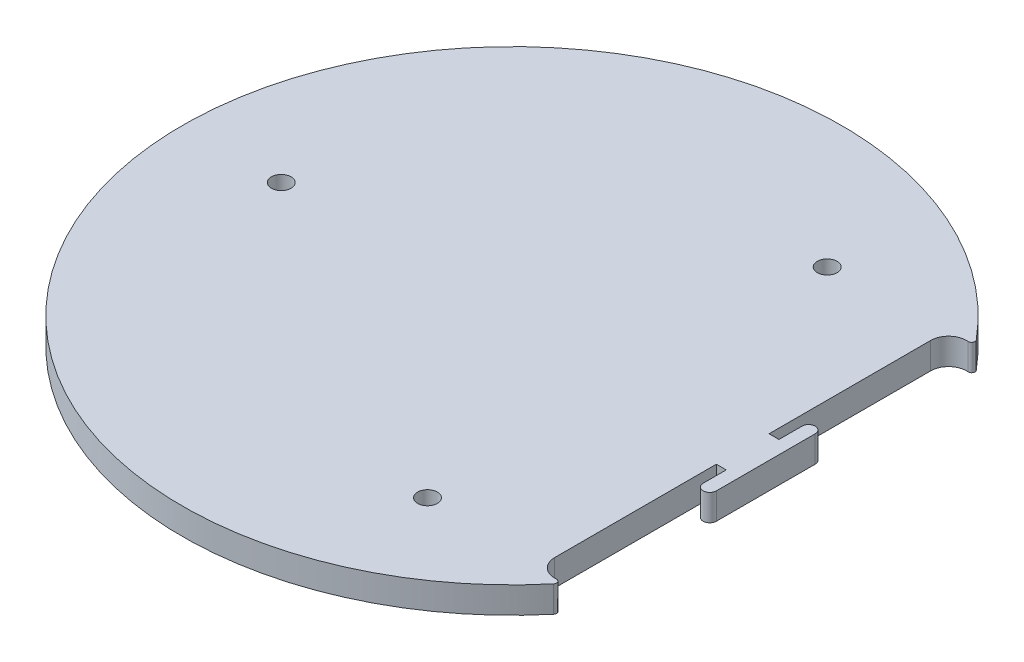
ISO-10303-21;
HEADER;
FILE_DESCRIPTION(('STEP AP214'),'2;1');
FILE_NAME('part.step','',(''),(''),'','','');
FILE_SCHEMA(('AUTOMOTIVE_DESIGN { 1 0 10303 214 1 1 1 1 }'));
ENDSEC;
DATA;
#1=APPLICATION_CONTEXT('core data for automotive mechanical design processes');
#2=APPLICATION_PROTOCOL_DEFINITION('international standard','automotive_design',2000,#1);
#3=PRODUCT_CONTEXT('',#1,'mechanical');
#4=PRODUCT('Part','Part','',(#3));
#5=PRODUCT_RELATED_PRODUCT_CATEGORY('part','',(#4));
#6=PRODUCT_DEFINITION_FORMATION('','',#4);
#7=PRODUCT_DEFINITION_CONTEXT('part definition',#1,'design');
#8=PRODUCT_DEFINITION('design','',#6,#7);
#9=PRODUCT_DEFINITION_SHAPE('','',#8);
#10=(LENGTH_UNIT() NAMED_UNIT(*) SI_UNIT(.MILLI.,.METRE.));
#11=(NAMED_UNIT(*) PLANE_ANGLE_UNIT() SI_UNIT($,.RADIAN.));
#12=(NAMED_UNIT(*) SI_UNIT($,.STERADIAN.) SOLID_ANGLE_UNIT());
#13=UNCERTAINTY_MEASURE_WITH_UNIT(LENGTH_MEASURE(1.E-05),#10,'distance_accuracy_value','');
#14=(GEOMETRIC_REPRESENTATION_CONTEXT(3) GLOBAL_UNCERTAINTY_ASSIGNED_CONTEXT((#13)) GLOBAL_UNIT_ASSIGNED_CONTEXT((#10,
#11,#12)) REPRESENTATION_CONTEXT('',''));
#15=CARTESIAN_POINT('',(0.,0.,0.));
#16=DIRECTION('',(0.,0.,1.));
#17=DIRECTION('',(1.,0.,0.));
#18=AXIS2_PLACEMENT_3D('',#15,#16,#17);
#19=CARTESIAN_POINT('',(0.,-2.,0.));
#20=DIRECTION('',(0.,1.,0.));
#21=DIRECTION('',(0.,0.,1.));
#22=AXIS2_PLACEMENT_3D('',#19,#20,#21);
#23=PLANE('',#22);
#24=DIRECTION('',(0.,0.,-1.));
#25=VECTOR('',#24,1.);
#26=CARTESIAN_POINT('',(38.5,-2.,0.));
#27=LINE('',#26,#25);
#28=CARTESIAN_POINT('',(38.5,-2.,7.5));
#29=VERTEX_POINT('',#28);
#30=CARTESIAN_POINT('',(38.5,-2.,-7.5));
#31=VERTEX_POINT('',#30);
#32=EDGE_CURVE('E171',#29,#31,#27,.T.);
#33=ORIENTED_EDGE('',*,*,#32,.F.);
#34=CARTESIAN_POINT('',(37.5,-2.,7.5));
#35=DIRECTION('',(0.,1.,0.));
#36=DIRECTION('',(0.,0.,1.));
#37=AXIS2_PLACEMENT_3D('',#34,#35,#36);
#38=CIRCLE('',#37,1.00000000000001);
#39=CARTESIAN_POINT('',(36.5,-2.,7.5));
#40=VERTEX_POINT('',#39);
#41=EDGE_CURVE('E104',#40,#29,#38,.T.);
#42=ORIENTED_EDGE('',*,*,#41,.F.);
#43=DIRECTION('',(0.,0.,-1.));
#44=VECTOR('',#43,1.);
#45=CARTESIAN_POINT('',(36.5,-2.,0.));
#46=LINE('',#45,#44);
#47=CARTESIAN_POINT('',(36.5,-2.,4.));
#48=VERTEX_POINT('',#47);
#49=EDGE_CURVE('E202',#40,#48,#46,.T.);
#50=ORIENTED_EDGE('',*,*,#49,.T.);
#51=DIRECTION('',(1.,0.,0.));
#52=VECTOR('',#51,1.);
#53=CARTESIAN_POINT('',(0.,-2.,4.));
#54=LINE('',#53,#52);
#55=CARTESIAN_POINT('',(35.,-2.,4.));
#56=VERTEX_POINT('',#55);
#57=EDGE_CURVE('E159',#56,#48,#54,.T.);
#58=ORIENTED_EDGE('',*,*,#57,.F.);
#59=DIRECTION('',(0.,0.,-1.));
#60=VECTOR('',#59,1.);
#61=CARTESIAN_POINT('',(35.,-2.,0.));
#62=LINE('',#61,#60);
#63=CARTESIAN_POINT('',(35.,-2.,28.5161138023531));
#64=VERTEX_POINT('',#63);
#65=EDGE_CURVE('E199',#64,#56,#62,.T.);
#66=ORIENTED_EDGE('',*,*,#65,.F.);
#67=CARTESIAN_POINT('',(37.7166544330073,-2.,28.5161138023531));
#68=DIRECTION('',(0.,1.,0.));
#69=DIRECTION('',(0.,0.,1.));
#70=AXIS2_PLACEMENT_3D('',#67,#68,#69);
#71=CIRCLE('',#70,2.71665443300733);
#72=CARTESIAN_POINT('',(37.9494092016024,-2.,31.2227790062664));
#73=VERTEX_POINT('',#72);
#74=EDGE_CURVE('E197',#73,#64,#71,.F.);
#75=ORIENTED_EDGE('',*,*,#74,.F.);
#76=CARTESIAN_POINT('',(37.9925630703769,-2.,31.7246079300356));
#77=DIRECTION('',(0.,1.,0.));
#78=DIRECTION('',(0.,0.,1.));
#79=AXIS2_PLACEMENT_3D('',#76,#77,#78);
#80=CIRCLE('',#79,0.503680975540726);
#81=CARTESIAN_POINT('',(38.3791803301599,-2.,32.0474416636503));
#82=VERTEX_POINT('',#81);
#83=EDGE_CURVE('E194',#73,#82,#80,.F.);
#84=ORIENTED_EDGE('',*,*,#83,.T.);
#85=CARTESIAN_POINT('',(0.,-2.,0.));
#86=DIRECTION('',(0.,1.,0.));
#87=DIRECTION('',(0.,0.,1.));
#88=AXIS2_PLACEMENT_3D('',#85,#86,#87);
#89=CIRCLE('',#88,50.);
#90=CARTESIAN_POINT('',(38.3791803301599,-2.,-32.0474416636503));
#91=VERTEX_POINT('',#90);
#92=EDGE_CURVE('E191',#91,#82,#89,.T.);
#93=ORIENTED_EDGE('',*,*,#92,.F.);
#94=CARTESIAN_POINT('',(37.9925630703769,-2.,-31.7246079300356));
#95=DIRECTION('',(0.,1.,0.));
#96=DIRECTION('',(0.,0.,1.));
#97=AXIS2_PLACEMENT_3D('',#94,#95,#96);
#98=CIRCLE('',#97,0.503680975540726);
#99=CARTESIAN_POINT('',(37.9494092016024,-2.,-31.2227790062663));
#100=VERTEX_POINT('',#99);
#101=EDGE_CURVE('E189',#100,#91,#98,.T.);
#102=ORIENTED_EDGE('',*,*,#101,.F.);
#103=CARTESIAN_POINT('',(37.7166544330073,-2.,-28.5161138023531));
#104=DIRECTION('',(0.,1.,0.));
#105=DIRECTION('',(0.,0.,1.));
#106=AXIS2_PLACEMENT_3D('',#103,#104,#105);
#107=CIRCLE('',#106,2.71665443300733);
#108=CARTESIAN_POINT('',(35.,-2.,-28.5161138023531));
#109=VERTEX_POINT('',#108);
#110=EDGE_CURVE('E186',#100,#109,#107,.T.);
#111=ORIENTED_EDGE('',*,*,#110,.T.);
#112=DIRECTION('',(0.,0.,-1.));
#113=VECTOR('',#112,1.);
#114=CARTESIAN_POINT('',(35.,-2.,0.));
#115=LINE('',#114,#113);
#116=CARTESIAN_POINT('',(35.,-2.,-4.));
#117=VERTEX_POINT('',#116);
#118=EDGE_CURVE('E183',#117,#109,#115,.T.);
#119=ORIENTED_EDGE('',*,*,#118,.F.);
#120=DIRECTION('',(1.,0.,0.));
#121=VECTOR('',#120,1.);
#122=CARTESIAN_POINT('',(0.,-2.,-4.));
#123=LINE('',#122,#121);
#124=CARTESIAN_POINT('',(36.5,-2.,-4.));
#125=VERTEX_POINT('',#124);
#126=EDGE_CURVE('E180',#117,#125,#123,.T.);
#127=ORIENTED_EDGE('',*,*,#126,.T.);
#128=DIRECTION('',(0.,0.,1.));
#129=VECTOR('',#128,1.);
#130=CARTESIAN_POINT('',(36.5,-2.,0.));
#131=LINE('',#130,#129);
#132=CARTESIAN_POINT('',(36.5,-2.,-7.5));
#133=VERTEX_POINT('',#132);
#134=EDGE_CURVE('E177',#133,#125,#131,.T.);
#135=ORIENTED_EDGE('',*,*,#134,.F.);
#136=CARTESIAN_POINT('',(37.5,-2.,-7.5));
#137=DIRECTION('',(0.,1.,0.));
#138=DIRECTION('',(0.,0.,1.));
#139=AXIS2_PLACEMENT_3D('',#136,#137,#138);
#140=CIRCLE('',#139,1.00000000000001);
#141=EDGE_CURVE('E174',#31,#133,#140,.T.);
#142=ORIENTED_EDGE('',*,*,#141,.F.);
#143=EDGE_LOOP('',(#33,#42,#50,#58,#66,#75,#84,#93,#102,#111,#119,#127,#135,#142));
#144=FACE_BOUND('',#143,.T.);
#145=CARTESIAN_POINT('',(-35.,-2.,0.));
#146=DIRECTION('',(0.,1.,0.));
#147=DIRECTION('',(0.,0.,1.));
#148=AXIS2_PLACEMENT_3D('',#145,#146,#147);
#149=CIRCLE('',#148,4.);
#150=CARTESIAN_POINT('',(-35.,-2.,4.));
#151=VERTEX_POINT('',#150);
#152=EDGE_CURVE('E232',#151,#151,#149,.F.);
#153=ORIENTED_EDGE('',*,*,#152,.F.);
#154=EDGE_LOOP('',(#153));
#155=FACE_BOUND('',#154,.T.);
#156=CARTESIAN_POINT('',(17.5,-2.,30.3108891324554));
#157=DIRECTION('',(0.,1.,0.));
#158=DIRECTION('',(0.,0.,1.));
#159=AXIS2_PLACEMENT_3D('',#156,#157,#158);
#160=CIRCLE('',#159,4.);
#161=CARTESIAN_POINT('',(17.5,-2.,34.3108891324554));
#162=VERTEX_POINT('',#161);
#163=EDGE_CURVE('E47',#162,#162,#160,.F.);
#164=ORIENTED_EDGE('',*,*,#163,.F.);
#165=EDGE_LOOP('',(#164));
#166=FACE_BOUND('',#165,.T.);
#167=CARTESIAN_POINT('',(17.5,-2.,-30.3108891324554));
#168=DIRECTION('',(0.,1.,0.));
#169=DIRECTION('',(0.,0.,1.));
#170=AXIS2_PLACEMENT_3D('',#167,#168,#169);
#171=CIRCLE('',#170,4.);
#172=CARTESIAN_POINT('',(17.5,-2.,-26.3108891324553));
#173=VERTEX_POINT('',#172);
#174=EDGE_CURVE('E11',#173,#173,#171,.F.);
#175=ORIENTED_EDGE('',*,*,#174,.F.);
#176=EDGE_LOOP('',(#175));
#177=FACE_BOUND('',#176,.T.);
#178=ADVANCED_FACE('F38',(#144,#155,#166,#177),#23,.F.);
#179=CARTESIAN_POINT('',(17.5,-2.,-30.3108891324554));
#180=DIRECTION('',(0.,-1.,0.));
#181=DIRECTION('',(0.,0.,-1.));
#182=AXIS2_PLACEMENT_3D('',#179,#180,#181);
#183=CIRCLE('',#182,3.);
#184=CARTESIAN_POINT('',(17.5,-2.,-33.3108891324554));
#185=VERTEX_POINT('',#184);
#186=EDGE_CURVE('E429',#185,#185,#183,.T.);
#187=ORIENTED_EDGE('',*,*,#186,.T.);
#188=EDGE_LOOP('',(#187));
#189=FACE_BOUND('',#188,.T.);
#190=CARTESIAN_POINT('',(17.5,-2.,-30.3108891324554));
#191=DIRECTION('',(0.,-1.,0.));
#192=DIRECTION('',(0.,0.,-1.));
#193=AXIS2_PLACEMENT_3D('',#190,#191,#192);
#194=CIRCLE('',#193,1.5);
#195=CARTESIAN_POINT('',(17.5,-2.,-31.8108891324553));
#196=VERTEX_POINT('',#195);
#197=EDGE_CURVE('E398',#196,#196,#194,.T.);
#198=ORIENTED_EDGE('',*,*,#197,.F.);
#199=EDGE_LOOP('',(#198));
#200=FACE_BOUND('',#199,.T.);
#201=ADVANCED_FACE('F241',(#189,#200),#23,.F.);
#202=CARTESIAN_POINT('',(17.5,-2.,30.3108891324554));
#203=DIRECTION('',(0.,-1.,0.));
#204=DIRECTION('',(0.,0.,-1.));
#205=AXIS2_PLACEMENT_3D('',#202,#203,#204);
#206=CIRCLE('',#205,2.99999999999999);
#207=CARTESIAN_POINT('',(17.5,-2.,27.3108891324554));
#208=VERTEX_POINT('',#207);
#209=EDGE_CURVE('E420',#208,#208,#206,.T.);
#210=ORIENTED_EDGE('',*,*,#209,.T.);
#211=EDGE_LOOP('',(#210));
#212=FACE_BOUND('',#211,.T.);
#213=CARTESIAN_POINT('',(17.5,-2.,30.3108891324554));
#214=DIRECTION('',(0.,-1.,0.));
#215=DIRECTION('',(0.,0.,-1.));
#216=AXIS2_PLACEMENT_3D('',#213,#214,#215);
#217=CIRCLE('',#216,1.5);
#218=CARTESIAN_POINT('',(17.5,-2.,28.8108891324554));
#219=VERTEX_POINT('',#218);
#220=EDGE_CURVE('E404',#219,#219,#217,.T.);
#221=ORIENTED_EDGE('',*,*,#220,.F.);
#222=EDGE_LOOP('',(#221));
#223=FACE_BOUND('',#222,.T.);
#224=ADVANCED_FACE('F304',(#212,#223),#23,.F.);
#225=CARTESIAN_POINT('',(38.5,2.,0.));
#226=DIRECTION('',(-1.,0.,0.));
#227=DIRECTION('',(0.,0.,1.));
#228=AXIS2_PLACEMENT_3D('',#225,#226,#227);
#229=PLANE('',#228);
#230=ORIENTED_EDGE('',*,*,#32,.T.);
#231=DIRECTION('',(0.,-1.,0.));
#232=VECTOR('',#231,1.);
#233=CARTESIAN_POINT('',(38.5,2.,-7.5));
#234=LINE('',#233,#232);
#235=CARTESIAN_POINT('',(38.5,2.,-7.5));
#236=VERTEX_POINT('',#235);
#237=EDGE_CURVE('E230',#236,#31,#234,.T.);
#238=ORIENTED_EDGE('',*,*,#237,.F.);
#239=DIRECTION('',(0.,0.,-1.));
#240=VECTOR('',#239,1.);
#241=CARTESIAN_POINT('',(38.5,2.,0.));
#242=LINE('',#241,#240);
#243=CARTESIAN_POINT('',(38.5,2.,7.5));
#244=VERTEX_POINT('',#243);
#245=EDGE_CURVE('E205',#244,#236,#242,.T.);
#246=ORIENTED_EDGE('',*,*,#245,.F.);
#247=DIRECTION('',(0.,-1.,0.));
#248=VECTOR('',#247,1.);
#249=CARTESIAN_POINT('',(38.5,2.,7.5));
#250=LINE('',#249,#248);
#251=EDGE_CURVE('E167',#244,#29,#250,.T.);
#252=ORIENTED_EDGE('',*,*,#251,.T.);
#253=EDGE_LOOP('',(#230,#238,#246,#252));
#254=FACE_BOUND('',#253,.T.);
#255=ADVANCED_FACE('F40',(#254),#229,.F.);
#256=CARTESIAN_POINT('',(37.5,2.,-7.5));
#257=DIRECTION('',(0.,-1.,0.));
#258=DIRECTION('',(0.,0.,-1.));
#259=AXIS2_PLACEMENT_3D('',#256,#257,#258);
#260=CYLINDRICAL_SURFACE('',#259,1.00000000000001);
#261=ORIENTED_EDGE('',*,*,#141,.T.);
#262=DIRECTION('',(0.,-1.,0.));
#263=VECTOR('',#262,1.);
#264=CARTESIAN_POINT('',(36.5,2.,-7.5));
#265=LINE('',#264,#263);
#266=CARTESIAN_POINT('',(36.5,2.,-7.5));
#267=VERTEX_POINT('',#266);
#268=EDGE_CURVE('E227',#267,#133,#265,.T.);
#269=ORIENTED_EDGE('',*,*,#268,.F.);
#270=CARTESIAN_POINT('',(37.5,2.,-7.5));
#271=DIRECTION('',(0.,1.,0.));
#272=DIRECTION('',(0.,0.,1.));
#273=AXIS2_PLACEMENT_3D('',#270,#271,#272);
#274=CIRCLE('',#273,1.00000000000001);
#275=EDGE_CURVE('E113',#236,#267,#274,.T.);
#276=ORIENTED_EDGE('',*,*,#275,.F.);
#277=ORIENTED_EDGE('',*,*,#237,.T.);
#278=EDGE_LOOP('',(#261,#269,#276,#277));
#279=FACE_BOUND('',#278,.T.);
#280=ADVANCED_FACE('F345',(#279),#260,.T.);
#281=CARTESIAN_POINT('',(36.5,2.,0.));
#282=DIRECTION('',(1.,0.,0.));
#283=DIRECTION('',(0.,0.,-1.));
#284=AXIS2_PLACEMENT_3D('',#281,#282,#283);
#285=PLANE('',#284);
#286=ORIENTED_EDGE('',*,*,#134,.T.);
#287=DIRECTION('',(0.,-1.,0.));
#288=VECTOR('',#287,1.);
#289=CARTESIAN_POINT('',(36.5,2.,-4.));
#290=LINE('',#289,#288);
#291=CARTESIAN_POINT('',(36.5,2.,-4.));
#292=VERTEX_POINT('',#291);
#293=EDGE_CURVE('E225',#292,#125,#290,.T.);
#294=ORIENTED_EDGE('',*,*,#293,.F.);
#295=DIRECTION('',(0.,0.,1.));
#296=VECTOR('',#295,1.);
#297=CARTESIAN_POINT('',(36.5,2.,0.));
#298=LINE('',#297,#296);
#299=EDGE_CURVE('E357',#267,#292,#298,.T.);
#300=ORIENTED_EDGE('',*,*,#299,.F.);
#301=ORIENTED_EDGE('',*,*,#268,.T.);
#302=EDGE_LOOP('',(#286,#294,#300,#301));
#303=FACE_BOUND('',#302,.T.);
#304=ADVANCED_FACE('F342',(#303),#285,.F.);
#305=CARTESIAN_POINT('',(0.,2.,-4.));
#306=DIRECTION('',(0.,0.,-1.));
#307=DIRECTION('',(-1.,0.,0.));
#308=AXIS2_PLACEMENT_3D('',#305,#306,#307);
#309=PLANE('',#308);
#310=ORIENTED_EDGE('',*,*,#126,.F.);
#311=DIRECTION('',(0.,-1.,0.));
#312=VECTOR('',#311,1.);
#313=CARTESIAN_POINT('',(35.,2.,-4.));
#314=LINE('',#313,#312);
#315=CARTESIAN_POINT('',(35.,2.,-4.));
#316=VERTEX_POINT('',#315);
#317=EDGE_CURVE('E223',#316,#117,#314,.T.);
#318=ORIENTED_EDGE('',*,*,#317,.F.);
#319=DIRECTION('',(1.,0.,0.));
#320=VECTOR('',#319,1.);
#321=CARTESIAN_POINT('',(0.,2.,-4.));
#322=LINE('',#321,#320);
#323=EDGE_CURVE('E364',#316,#292,#322,.T.);
#324=ORIENTED_EDGE('',*,*,#323,.T.);
#325=ORIENTED_EDGE('',*,*,#293,.T.);
#326=EDGE_LOOP('',(#310,#318,#324,#325));
#327=FACE_BOUND('',#326,.T.);
#328=ADVANCED_FACE('F338',(#327),#309,.T.);
#329=CARTESIAN_POINT('',(35.,2.,0.));
#330=DIRECTION('',(-1.,0.,0.));
#331=DIRECTION('',(0.,0.,1.));
#332=AXIS2_PLACEMENT_3D('',#329,#330,#331);
#333=PLANE('',#332);
#334=ORIENTED_EDGE('',*,*,#118,.T.);
#335=DIRECTION('',(0.,-1.,0.));
#336=VECTOR('',#335,1.);
#337=CARTESIAN_POINT('',(35.,2.,-28.5161138023531));
#338=LINE('',#337,#336);
#339=CARTESIAN_POINT('',(35.,2.,-28.5161138023531));
#340=VERTEX_POINT('',#339);
#341=EDGE_CURVE('E221',#340,#109,#338,.T.);
#342=ORIENTED_EDGE('',*,*,#341,.F.);
#343=DIRECTION('',(0.,0.,-1.));
#344=VECTOR('',#343,1.);
#345=CARTESIAN_POINT('',(35.,2.,0.));
#346=LINE('',#345,#344);
#347=EDGE_CURVE('E365',#316,#340,#346,.T.);
#348=ORIENTED_EDGE('',*,*,#347,.F.);
#349=ORIENTED_EDGE('',*,*,#317,.T.);
#350=EDGE_LOOP('',(#334,#342,#348,#349));
#351=FACE_BOUND('',#350,.T.);
#352=ADVANCED_FACE('F334',(#351),#333,.F.);
#353=CARTESIAN_POINT('',(37.7166544330073,2.,-28.5161138023531));
#354=DIRECTION('',(0.,-1.,0.));
#355=DIRECTION('',(0.,0.,-1.));
#356=AXIS2_PLACEMENT_3D('',#353,#354,#355);
#357=CYLINDRICAL_SURFACE('',#356,2.71665443300733);
#358=ORIENTED_EDGE('',*,*,#110,.F.);
#359=DIRECTION('',(0.,-1.,0.));
#360=VECTOR('',#359,1.);
#361=CARTESIAN_POINT('',(37.9494092016024,2.,-31.2227790062663));
#362=LINE('',#361,#360);
#363=CARTESIAN_POINT('',(37.9494092016024,2.,-31.2227790062663));
#364=VERTEX_POINT('',#363);
#365=EDGE_CURVE('E219',#364,#100,#362,.T.);
#366=ORIENTED_EDGE('',*,*,#365,.F.);
#367=CARTESIAN_POINT('',(37.7166544330073,2.,-28.5161138023531));
#368=DIRECTION('',(0.,1.,0.));
#369=DIRECTION('',(0.,0.,1.));
#370=AXIS2_PLACEMENT_3D('',#367,#368,#369);
#371=CIRCLE('',#370,2.71665443300733);
#372=EDGE_CURVE('E367',#364,#340,#371,.T.);
#373=ORIENTED_EDGE('',*,*,#372,.T.);
#374=ORIENTED_EDGE('',*,*,#341,.T.);
#375=EDGE_LOOP('',(#358,#366,#373,#374));
#376=FACE_BOUND('',#375,.T.);
#377=ADVANCED_FACE('F330',(#376),#357,.F.);
#378=CARTESIAN_POINT('',(37.9925630703769,2.,-31.7246079300356));
#379=DIRECTION('',(0.,-1.,0.));
#380=DIRECTION('',(0.,0.,-1.));
#381=AXIS2_PLACEMENT_3D('',#378,#379,#380);
#382=CYLINDRICAL_SURFACE('',#381,0.503680975540726);
#383=ORIENTED_EDGE('',*,*,#101,.T.);
#384=DIRECTION('',(0.,-1.,0.));
#385=VECTOR('',#384,1.);
#386=CARTESIAN_POINT('',(38.3791803301599,2.,-32.0474416636503));
#387=LINE('',#386,#385);
#388=CARTESIAN_POINT('',(38.3791803301599,2.,-32.0474416636503));
#389=VERTEX_POINT('',#388);
#390=EDGE_CURVE('E216',#389,#91,#387,.T.);
#391=ORIENTED_EDGE('',*,*,#390,.F.);
#392=CARTESIAN_POINT('',(37.9925630703769,2.,-31.7246079300356));
#393=DIRECTION('',(0.,1.,0.));
#394=DIRECTION('',(0.,0.,1.));
#395=AXIS2_PLACEMENT_3D('',#392,#393,#394);
#396=CIRCLE('',#395,0.503680975540726);
#397=EDGE_CURVE('E374',#364,#389,#396,.T.);
#398=ORIENTED_EDGE('',*,*,#397,.F.);
#399=ORIENTED_EDGE('',*,*,#365,.T.);
#400=EDGE_LOOP('',(#383,#391,#398,#399));
#401=FACE_BOUND('',#400,.T.);
#402=ADVANCED_FACE('F326',(#401),#382,.T.);
#403=CARTESIAN_POINT('',(0.,2.,0.));
#404=DIRECTION('',(0.,-1.,0.));
#405=DIRECTION('',(0.,0.,-1.));
#406=AXIS2_PLACEMENT_3D('',#403,#404,#405);
#407=CYLINDRICAL_SURFACE('',#406,50.);
#408=ORIENTED_EDGE('',*,*,#92,.T.);
#409=DIRECTION('',(0.,-1.,0.));
#410=VECTOR('',#409,1.);
#411=CARTESIAN_POINT('',(38.3791803301599,2.,32.0474416636503));
#412=LINE('',#411,#410);
#413=CARTESIAN_POINT('',(38.3791803301599,2.,32.0474416636503));
#414=VERTEX_POINT('',#413);
#415=EDGE_CURVE('E214',#414,#82,#412,.T.);
#416=ORIENTED_EDGE('',*,*,#415,.F.);
#417=CARTESIAN_POINT('',(0.,2.,0.));
#418=DIRECTION('',(0.,1.,0.));
#419=DIRECTION('',(0.,0.,1.));
#420=AXIS2_PLACEMENT_3D('',#417,#418,#419);
#421=CIRCLE('',#420,50.);
#422=EDGE_CURVE('E376',#389,#414,#421,.T.);
#423=ORIENTED_EDGE('',*,*,#422,.F.);
#424=ORIENTED_EDGE('',*,*,#390,.T.);
#425=EDGE_LOOP('',(#408,#416,#423,#424));
#426=FACE_BOUND('',#425,.T.);
#427=ADVANCED_FACE('F322',(#426),#407,.T.);
#428=CARTESIAN_POINT('',(37.9925630703769,2.,31.7246079300356));
#429=DIRECTION('',(0.,-1.,0.));
#430=DIRECTION('',(0.,0.,-1.));
#431=AXIS2_PLACEMENT_3D('',#428,#429,#430);
#432=CYLINDRICAL_SURFACE('',#431,0.503680975540726);
#433=ORIENTED_EDGE('',*,*,#83,.F.);
#434=DIRECTION('',(0.,-1.,0.));
#435=VECTOR('',#434,1.);
#436=CARTESIAN_POINT('',(37.9494092016024,2.,31.2227790062664));
#437=LINE('',#436,#435);
#438=CARTESIAN_POINT('',(37.9494092016024,2.,31.2227790062664));
#439=VERTEX_POINT('',#438);
#440=EDGE_CURVE('E212',#439,#73,#437,.T.);
#441=ORIENTED_EDGE('',*,*,#440,.F.);
#442=CARTESIAN_POINT('',(37.9925630703769,2.,31.7246079300356));
#443=DIRECTION('',(0.,1.,0.));
#444=DIRECTION('',(0.,0.,1.));
#445=AXIS2_PLACEMENT_3D('',#442,#443,#444);
#446=CIRCLE('',#445,0.503680975540726);
#447=EDGE_CURVE('E378',#439,#414,#446,.F.);
#448=ORIENTED_EDGE('',*,*,#447,.T.);
#449=ORIENTED_EDGE('',*,*,#415,.T.);
#450=EDGE_LOOP('',(#433,#441,#448,#449));
#451=FACE_BOUND('',#450,.T.);
#452=ADVANCED_FACE('F318',(#451),#432,.T.);
#453=CARTESIAN_POINT('',(37.7166544330073,2.,28.5161138023531));
#454=DIRECTION('',(0.,-1.,0.));
#455=DIRECTION('',(0.,0.,-1.));
#456=AXIS2_PLACEMENT_3D('',#453,#454,#455);
#457=CYLINDRICAL_SURFACE('',#456,2.71665443300733);
#458=ORIENTED_EDGE('',*,*,#74,.T.);
#459=DIRECTION('',(0.,-1.,0.));
#460=VECTOR('',#459,1.);
#461=CARTESIAN_POINT('',(35.,2.,28.5161138023531));
#462=LINE('',#461,#460);
#463=CARTESIAN_POINT('',(35.,2.,28.5161138023531));
#464=VERTEX_POINT('',#463);
#465=EDGE_CURVE('E209',#464,#64,#462,.T.);
#466=ORIENTED_EDGE('',*,*,#465,.F.);
#467=CARTESIAN_POINT('',(37.7166544330073,2.,28.5161138023531));
#468=DIRECTION('',(0.,1.,0.));
#469=DIRECTION('',(0.,0.,1.));
#470=AXIS2_PLACEMENT_3D('',#467,#468,#469);
#471=CIRCLE('',#470,2.71665443300733);
#472=EDGE_CURVE('E381',#439,#464,#471,.F.);
#473=ORIENTED_EDGE('',*,*,#472,.F.);
#474=ORIENTED_EDGE('',*,*,#440,.T.);
#475=EDGE_LOOP('',(#458,#466,#473,#474));
#476=FACE_BOUND('',#475,.T.);
#477=ADVANCED_FACE('F314',(#476),#457,.F.);
#478=CARTESIAN_POINT('',(35.,2.,0.));
#479=DIRECTION('',(-1.,0.,0.));
#480=DIRECTION('',(0.,0.,1.));
#481=AXIS2_PLACEMENT_3D('',#478,#479,#480);
#482=PLANE('',#481);
#483=ORIENTED_EDGE('',*,*,#65,.T.);
#484=DIRECTION('',(0.,-1.,0.));
#485=VECTOR('',#484,1.);
#486=CARTESIAN_POINT('',(35.,2.,4.));
#487=LINE('',#486,#485);
#488=CARTESIAN_POINT('',(35.,2.,4.));
#489=VERTEX_POINT('',#488);
#490=EDGE_CURVE('E163',#489,#56,#487,.T.);
#491=ORIENTED_EDGE('',*,*,#490,.F.);
#492=DIRECTION('',(0.,0.,-1.));
#493=VECTOR('',#492,1.);
#494=CARTESIAN_POINT('',(35.,2.,0.));
#495=LINE('',#494,#493);
#496=EDGE_CURVE('E150',#464,#489,#495,.T.);
#497=ORIENTED_EDGE('',*,*,#496,.F.);
#498=ORIENTED_EDGE('',*,*,#465,.T.);
#499=EDGE_LOOP('',(#483,#491,#497,#498));
#500=FACE_BOUND('',#499,.T.);
#501=ADVANCED_FACE('F311',(#500),#482,.F.);
#502=CARTESIAN_POINT('',(0.,2.,4.));
#503=DIRECTION('',(0.,0.,-1.));
#504=DIRECTION('',(-1.,0.,0.));
#505=AXIS2_PLACEMENT_3D('',#502,#503,#504);
#506=PLANE('',#505);
#507=ORIENTED_EDGE('',*,*,#57,.T.);
#508=DIRECTION('',(0.,-1.,0.));
#509=VECTOR('',#508,1.);
#510=CARTESIAN_POINT('',(36.5,2.,4.));
#511=LINE('',#510,#509);
#512=CARTESIAN_POINT('',(36.5,2.,4.));
#513=VERTEX_POINT('',#512);
#514=EDGE_CURVE('E156',#513,#48,#511,.T.);
#515=ORIENTED_EDGE('',*,*,#514,.F.);
#516=DIRECTION('',(1.,0.,0.));
#517=VECTOR('',#516,1.);
#518=CARTESIAN_POINT('',(0.,2.,4.));
#519=LINE('',#518,#517);
#520=EDGE_CURVE('E144',#489,#513,#519,.T.);
#521=ORIENTED_EDGE('',*,*,#520,.F.);
#522=ORIENTED_EDGE('',*,*,#490,.T.);
#523=EDGE_LOOP('',(#507,#515,#521,#522));
#524=FACE_BOUND('',#523,.T.);
#525=ADVANCED_FACE('F157',(#524),#506,.F.);
#526=CARTESIAN_POINT('',(36.5,2.,0.));
#527=DIRECTION('',(-1.,0.,0.));
#528=DIRECTION('',(0.,0.,1.));
#529=AXIS2_PLACEMENT_3D('',#526,#527,#528);
#530=PLANE('',#529);
#531=ORIENTED_EDGE('',*,*,#49,.F.);
#532=DIRECTION('',(0.,-1.,0.));
#533=VECTOR('',#532,1.);
#534=CARTESIAN_POINT('',(36.5,2.,7.5));
#535=LINE('',#534,#533);
#536=CARTESIAN_POINT('',(36.5,2.,7.5));
#537=VERTEX_POINT('',#536);
#538=EDGE_CURVE('E101',#537,#40,#535,.T.);
#539=ORIENTED_EDGE('',*,*,#538,.F.);
#540=DIRECTION('',(0.,0.,-1.));
#541=VECTOR('',#540,1.);
#542=CARTESIAN_POINT('',(36.5,2.,0.));
#543=LINE('',#542,#541);
#544=EDGE_CURVE('E148',#537,#513,#543,.T.);
#545=ORIENTED_EDGE('',*,*,#544,.T.);
#546=ORIENTED_EDGE('',*,*,#514,.T.);
#547=EDGE_LOOP('',(#531,#539,#545,#546));
#548=FACE_BOUND('',#547,.T.);
#549=ADVANCED_FACE('F165',(#548),#530,.T.);
#550=CARTESIAN_POINT('',(37.5,2.,7.5));
#551=DIRECTION('',(0.,-1.,0.));
#552=DIRECTION('',(0.,0.,-1.));
#553=AXIS2_PLACEMENT_3D('',#550,#551,#552);
#554=CYLINDRICAL_SURFACE('',#553,1.00000000000001);
#555=ORIENTED_EDGE('',*,*,#41,.T.);
#556=ORIENTED_EDGE('',*,*,#251,.F.);
#557=CARTESIAN_POINT('',(37.5,2.,7.5));
#558=DIRECTION('',(0.,1.,0.));
#559=DIRECTION('',(0.,0.,1.));
#560=AXIS2_PLACEMENT_3D('',#557,#558,#559);
#561=CIRCLE('',#560,1.00000000000001);
#562=EDGE_CURVE('E55',#537,#244,#561,.T.);
#563=ORIENTED_EDGE('',*,*,#562,.F.);
#564=ORIENTED_EDGE('',*,*,#538,.T.);
#565=EDGE_LOOP('',(#555,#556,#563,#564));
#566=FACE_BOUND('',#565,.T.);
#567=ADVANCED_FACE('F299',(#566),#554,.T.);
#568=CARTESIAN_POINT('',(0.,2.,0.));
#569=DIRECTION('',(0.,1.,0.));
#570=DIRECTION('',(0.,0.,1.));
#571=AXIS2_PLACEMENT_3D('',#568,#569,#570);
#572=PLANE('',#571);
#573=CARTESIAN_POINT('',(17.5,2.,30.3108891324554));
#574=DIRECTION('',(0.,1.,0.));
#575=DIRECTION('',(0.,0.,1.));
#576=AXIS2_PLACEMENT_3D('',#573,#574,#575);
#577=CIRCLE('',#576,1.5);
#578=CARTESIAN_POINT('',(17.5,2.,31.8108891324554));
#579=VERTEX_POINT('',#578);
#580=EDGE_CURVE('E401',#579,#579,#577,.T.);
#581=ORIENTED_EDGE('',*,*,#580,.F.);
#582=EDGE_LOOP('',(#581));
#583=FACE_BOUND('',#582,.T.);
#584=CARTESIAN_POINT('',(17.5,2.,-30.3108891324554));
#585=DIRECTION('',(0.,1.,0.));
#586=DIRECTION('',(0.,0.,1.));
#587=AXIS2_PLACEMENT_3D('',#584,#585,#586);
#588=CIRCLE('',#587,1.5);
#589=CARTESIAN_POINT('',(17.5,2.,-28.8108891324553));
#590=VERTEX_POINT('',#589);
#591=EDGE_CURVE('E395',#590,#590,#588,.T.);
#592=ORIENTED_EDGE('',*,*,#591,.F.);
#593=EDGE_LOOP('',(#592));
#594=FACE_BOUND('',#593,.T.);
#595=CARTESIAN_POINT('',(-35.,2.,0.));
#596=DIRECTION('',(0.,1.,0.));
#597=DIRECTION('',(0.,0.,1.));
#598=AXIS2_PLACEMENT_3D('',#595,#596,#597);
#599=CIRCLE('',#598,1.5);
#600=CARTESIAN_POINT('',(-35.,2.,1.50000000000001));
#601=VERTEX_POINT('',#600);
#602=EDGE_CURVE('E175',#601,#601,#599,.T.);
#603=ORIENTED_EDGE('',*,*,#602,.F.);
#604=EDGE_LOOP('',(#603));
#605=FACE_BOUND('',#604,.T.);
#606=ORIENTED_EDGE('',*,*,#245,.T.);
#607=ORIENTED_EDGE('',*,*,#275,.T.);
#608=ORIENTED_EDGE('',*,*,#299,.T.);
#609=ORIENTED_EDGE('',*,*,#323,.F.);
#610=ORIENTED_EDGE('',*,*,#347,.T.);
#611=ORIENTED_EDGE('',*,*,#372,.F.);
#612=ORIENTED_EDGE('',*,*,#397,.T.);
#613=ORIENTED_EDGE('',*,*,#422,.T.);
#614=ORIENTED_EDGE('',*,*,#447,.F.);
#615=ORIENTED_EDGE('',*,*,#472,.T.);
#616=ORIENTED_EDGE('',*,*,#496,.T.);
#617=ORIENTED_EDGE('',*,*,#520,.T.);
#618=ORIENTED_EDGE('',*,*,#544,.F.);
#619=ORIENTED_EDGE('',*,*,#562,.T.);
#620=EDGE_LOOP('',(#606,#607,#608,#609,#610,#611,#612,#613,#614,#615,#616,#617,#618,#619));
#621=FACE_BOUND('',#620,.T.);
#622=ADVANCED_FACE('F146',(#583,#594,#605,#621),#572,.T.);
#623=CARTESIAN_POINT('',(-35.,-2.,0.));
#624=DIRECTION('',(0.,-1.,0.));
#625=DIRECTION('',(0.,0.,-1.));
#626=AXIS2_PLACEMENT_3D('',#623,#624,#625);
#627=CIRCLE('',#626,2.99999999999999);
#628=CARTESIAN_POINT('',(-35.,-2.,-2.99999999999999));
#629=VERTEX_POINT('',#628);
#630=EDGE_CURVE('E411',#629,#629,#627,.T.);
#631=ORIENTED_EDGE('',*,*,#630,.T.);
#632=EDGE_LOOP('',(#631));
#633=FACE_BOUND('',#632,.T.);
#634=CARTESIAN_POINT('',(-35.,-2.,0.));
#635=DIRECTION('',(0.,-1.,0.));
#636=DIRECTION('',(0.,0.,-1.));
#637=AXIS2_PLACEMENT_3D('',#634,#635,#636);
#638=CIRCLE('',#637,1.5);
#639=CARTESIAN_POINT('',(-35.,-2.,-1.5));
#640=VERTEX_POINT('',#639);
#641=EDGE_CURVE('E392',#640,#640,#638,.T.);
#642=ORIENTED_EDGE('',*,*,#641,.F.);
#643=EDGE_LOOP('',(#642));
#644=FACE_BOUND('',#643,.T.);
#645=ADVANCED_FACE('F244',(#633,#644),#23,.F.);
#646=CARTESIAN_POINT('',(-35.,5.,0.));
#647=DIRECTION('',(0.,-1.,0.));
#648=DIRECTION('',(0.,0.,-1.));
#649=AXIS2_PLACEMENT_3D('',#646,#647,#648);
#650=CYLINDRICAL_SURFACE('',#649,1.5);
#651=ORIENTED_EDGE('',*,*,#602,.T.);
#652=EDGE_LOOP('',(#651));
#653=FACE_BOUND('',#652,.T.);
#654=ORIENTED_EDGE('',*,*,#641,.T.);
#655=EDGE_LOOP('',(#654));
#656=FACE_BOUND('',#655,.T.);
#657=ADVANCED_FACE('F293',(#653,#656),#650,.F.);
#658=CARTESIAN_POINT('',(17.5,5.,-30.3108891324554));
#659=DIRECTION('',(0.,-1.,0.));
#660=DIRECTION('',(0.,0.,-1.));
#661=AXIS2_PLACEMENT_3D('',#658,#659,#660);
#662=CYLINDRICAL_SURFACE('',#661,1.5);
#663=ORIENTED_EDGE('',*,*,#591,.T.);
#664=EDGE_LOOP('',(#663));
#665=FACE_BOUND('',#664,.T.);
#666=ORIENTED_EDGE('',*,*,#197,.T.);
#667=EDGE_LOOP('',(#666));
#668=FACE_BOUND('',#667,.T.);
#669=ADVANCED_FACE('F289',(#665,#668),#662,.F.);
#670=CARTESIAN_POINT('',(17.5,5.,30.3108891324554));
#671=DIRECTION('',(0.,-1.,0.));
#672=DIRECTION('',(0.,0.,-1.));
#673=AXIS2_PLACEMENT_3D('',#670,#671,#672);
#674=CYLINDRICAL_SURFACE('',#673,1.5);
#675=ORIENTED_EDGE('',*,*,#580,.T.);
#676=EDGE_LOOP('',(#675));
#677=FACE_BOUND('',#676,.T.);
#678=ORIENTED_EDGE('',*,*,#220,.T.);
#679=EDGE_LOOP('',(#678));
#680=FACE_BOUND('',#679,.T.);
#681=ADVANCED_FACE('F282',(#677,#680),#674,.F.);
#682=CARTESIAN_POINT('',(-35.,-7.,0.));
#683=DIRECTION('',(0.,-1.,0.));
#684=DIRECTION('',(0.,0.,-1.));
#685=AXIS2_PLACEMENT_3D('',#682,#683,#684);
#686=PLANE('',#685);
#687=CARTESIAN_POINT('',(-35.,-7.,0.));
#688=DIRECTION('',(0.,-1.,0.));
#689=DIRECTION('',(0.,0.,-1.));
#690=AXIS2_PLACEMENT_3D('',#687,#688,#689);
#691=CIRCLE('',#690,4.);
#692=CARTESIAN_POINT('',(-35.,-7.,-3.99999999999999));
#693=VERTEX_POINT('',#692);
#694=EDGE_CURVE('E407',#693,#693,#691,.T.);
#695=ORIENTED_EDGE('',*,*,#694,.T.);
#696=EDGE_LOOP('',(#695));
#697=FACE_BOUND('',#696,.T.);
#698=CARTESIAN_POINT('',(-35.,-7.,0.));
#699=DIRECTION('',(0.,-1.,0.));
#700=DIRECTION('',(0.,0.,-1.));
#701=AXIS2_PLACEMENT_3D('',#698,#699,#700);
#702=CIRCLE('',#701,2.99999999999999);
#703=CARTESIAN_POINT('',(-35.,-7.,-2.99999999999999));
#704=VERTEX_POINT('',#703);
#705=EDGE_CURVE('E410',#704,#704,#702,.T.);
#706=ORIENTED_EDGE('',*,*,#705,.F.);
#707=EDGE_LOOP('',(#706));
#708=FACE_BOUND('',#707,.T.);
#709=ADVANCED_FACE('F279',(#697,#708),#686,.T.);
#710=CARTESIAN_POINT('',(-35.,-7.,0.));
#711=DIRECTION('',(0.,1.,0.));
#712=DIRECTION('',(0.,0.,1.));
#713=AXIS2_PLACEMENT_3D('',#710,#711,#712);
#714=CYLINDRICAL_SURFACE('',#713,4.);
#715=ORIENTED_EDGE('',*,*,#694,.F.);
#716=EDGE_LOOP('',(#715));
#717=FACE_BOUND('',#716,.T.);
#718=ORIENTED_EDGE('',*,*,#152,.T.);
#719=EDGE_LOOP('',(#718));
#720=FACE_BOUND('',#719,.T.);
#721=ADVANCED_FACE('F277',(#717,#720),#714,.T.);
#722=CARTESIAN_POINT('',(-35.,-7.,0.));
#723=DIRECTION('',(0.,1.,0.));
#724=DIRECTION('',(0.,0.,1.));
#725=AXIS2_PLACEMENT_3D('',#722,#723,#724);
#726=CYLINDRICAL_SURFACE('',#725,2.99999999999999);
#727=ORIENTED_EDGE('',*,*,#705,.T.);
#728=EDGE_LOOP('',(#727));
#729=FACE_BOUND('',#728,.T.);
#730=ORIENTED_EDGE('',*,*,#630,.F.);
#731=EDGE_LOOP('',(#730));
#732=FACE_BOUND('',#731,.T.);
#733=ADVANCED_FACE('F270',(#729,#732),#726,.F.);
#734=CARTESIAN_POINT('',(17.5,-7.,30.3108891324554));
#735=DIRECTION('',(0.,-1.,0.));
#736=DIRECTION('',(0.,0.,-1.));
#737=AXIS2_PLACEMENT_3D('',#734,#735,#736);
#738=PLANE('',#737);
#739=CARTESIAN_POINT('',(17.5,-7.,30.3108891324554));
#740=DIRECTION('',(0.,-1.,0.));
#741=DIRECTION('',(0.,0.,-1.));
#742=AXIS2_PLACEMENT_3D('',#739,#740,#741);
#743=CIRCLE('',#742,4.);
#744=CARTESIAN_POINT('',(17.5,-7.,26.3108891324554));
#745=VERTEX_POINT('',#744);
#746=EDGE_CURVE('E414',#745,#745,#743,.T.);
#747=ORIENTED_EDGE('',*,*,#746,.T.);
#748=EDGE_LOOP('',(#747));
#749=FACE_BOUND('',#748,.T.);
#750=CARTESIAN_POINT('',(17.5,-7.,30.3108891324554));
#751=DIRECTION('',(0.,-1.,0.));
#752=DIRECTION('',(0.,0.,-1.));
#753=AXIS2_PLACEMENT_3D('',#750,#751,#752);
#754=CIRCLE('',#753,2.99999999999999);
#755=CARTESIAN_POINT('',(17.5,-7.,27.3108891324554));
#756=VERTEX_POINT('',#755);
#757=EDGE_CURVE('E419',#756,#756,#754,.T.);
#758=ORIENTED_EDGE('',*,*,#757,.F.);
#759=EDGE_LOOP('',(#758));
#760=FACE_BOUND('',#759,.T.);
#761=ADVANCED_FACE('F267',(#749,#760),#738,.T.);
#762=CARTESIAN_POINT('',(17.5,-7.,30.3108891324554));
#763=DIRECTION('',(0.,1.,0.));
#764=DIRECTION('',(0.,0.,1.));
#765=AXIS2_PLACEMENT_3D('',#762,#763,#764);
#766=CYLINDRICAL_SURFACE('',#765,4.);
#767=ORIENTED_EDGE('',*,*,#746,.F.);
#768=EDGE_LOOP('',(#767));
#769=FACE_BOUND('',#768,.T.);
#770=ORIENTED_EDGE('',*,*,#163,.T.);
#771=EDGE_LOOP('',(#770));
#772=FACE_BOUND('',#771,.T.);
#773=ADVANCED_FACE('F237',(#769,#772),#766,.T.);
#774=CARTESIAN_POINT('',(17.5,-7.,30.3108891324554));
#775=DIRECTION('',(0.,1.,0.));
#776=DIRECTION('',(0.,0.,1.));
#777=AXIS2_PLACEMENT_3D('',#774,#775,#776);
#778=CYLINDRICAL_SURFACE('',#777,2.99999999999999);
#779=ORIENTED_EDGE('',*,*,#757,.T.);
#780=EDGE_LOOP('',(#779));
#781=FACE_BOUND('',#780,.T.);
#782=ORIENTED_EDGE('',*,*,#209,.F.);
#783=EDGE_LOOP('',(#782));
#784=FACE_BOUND('',#783,.T.);
#785=ADVANCED_FACE('F259',(#781,#784),#778,.F.);
#786=CARTESIAN_POINT('',(17.5,-7.,-30.3108891324554));
#787=DIRECTION('',(0.,-1.,0.));
#788=DIRECTION('',(0.,0.,-1.));
#789=AXIS2_PLACEMENT_3D('',#786,#787,#788);
#790=PLANE('',#789);
#791=CARTESIAN_POINT('',(17.5,-7.,-30.3108891324554));
#792=DIRECTION('',(0.,-1.,0.));
#793=DIRECTION('',(0.,0.,-1.));
#794=AXIS2_PLACEMENT_3D('',#791,#792,#793);
#795=CIRCLE('',#794,4.);
#796=CARTESIAN_POINT('',(17.5,-7.,-34.3108891324554));
#797=VERTEX_POINT('',#796);
#798=EDGE_CURVE('E423',#797,#797,#795,.T.);
#799=ORIENTED_EDGE('',*,*,#798,.T.);
#800=EDGE_LOOP('',(#799));
#801=FACE_BOUND('',#800,.T.);
#802=CARTESIAN_POINT('',(17.5,-7.,-30.3108891324554));
#803=DIRECTION('',(0.,-1.,0.));
#804=DIRECTION('',(0.,0.,-1.));
#805=AXIS2_PLACEMENT_3D('',#802,#803,#804);
#806=CIRCLE('',#805,3.);
#807=CARTESIAN_POINT('',(17.5,-7.,-33.3108891324554));
#808=VERTEX_POINT('',#807);
#809=EDGE_CURVE('E428',#808,#808,#806,.T.);
#810=ORIENTED_EDGE('',*,*,#809,.F.);
#811=EDGE_LOOP('',(#810));
#812=FACE_BOUND('',#811,.T.);
#813=ADVANCED_FACE('F250',(#801,#812),#790,.T.);
#814=CARTESIAN_POINT('',(17.5,-7.,-30.3108891324554));
#815=DIRECTION('',(0.,1.,0.));
#816=DIRECTION('',(0.,0.,1.));
#817=AXIS2_PLACEMENT_3D('',#814,#815,#816);
#818=CYLINDRICAL_SURFACE('',#817,4.);
#819=ORIENTED_EDGE('',*,*,#798,.F.);
#820=EDGE_LOOP('',(#819));
#821=FACE_BOUND('',#820,.T.);
#822=ORIENTED_EDGE('',*,*,#174,.T.);
#823=EDGE_LOOP('',(#822));
#824=FACE_BOUND('',#823,.T.);
#825=ADVANCED_FACE('F247',(#821,#824),#818,.T.);
#826=CARTESIAN_POINT('',(17.5,-7.,-30.3108891324554));
#827=DIRECTION('',(0.,1.,0.));
#828=DIRECTION('',(0.,0.,1.));
#829=AXIS2_PLACEMENT_3D('',#826,#827,#828);
#830=CYLINDRICAL_SURFACE('',#829,3.);
#831=ORIENTED_EDGE('',*,*,#809,.T.);
#832=EDGE_LOOP('',(#831));
#833=FACE_BOUND('',#832,.T.);
#834=ORIENTED_EDGE('',*,*,#186,.F.);
#835=EDGE_LOOP('',(#834));
#836=FACE_BOUND('',#835,.T.);
#837=ADVANCED_FACE('F249',(#833,#836),#830,.F.);
#838=CLOSED_SHELL('',(#178,#201,#224,#255,#280,#304,#328,#352,#377,#402,#427,#452,#477,#501,
#525,#549,#567,#622,#645,#657,#669,#681,#709,#721,#733,#761,#773,#785,#813,#825,#837));
#839=MANIFOLD_SOLID_BREP('B2',#838);
#840=ADVANCED_BREP_SHAPE_REPRESENTATION('',(#18,#839),#14);
#841=SHAPE_DEFINITION_REPRESENTATION(#9,#840);
ENDSEC;
END-ISO-10303-21;
